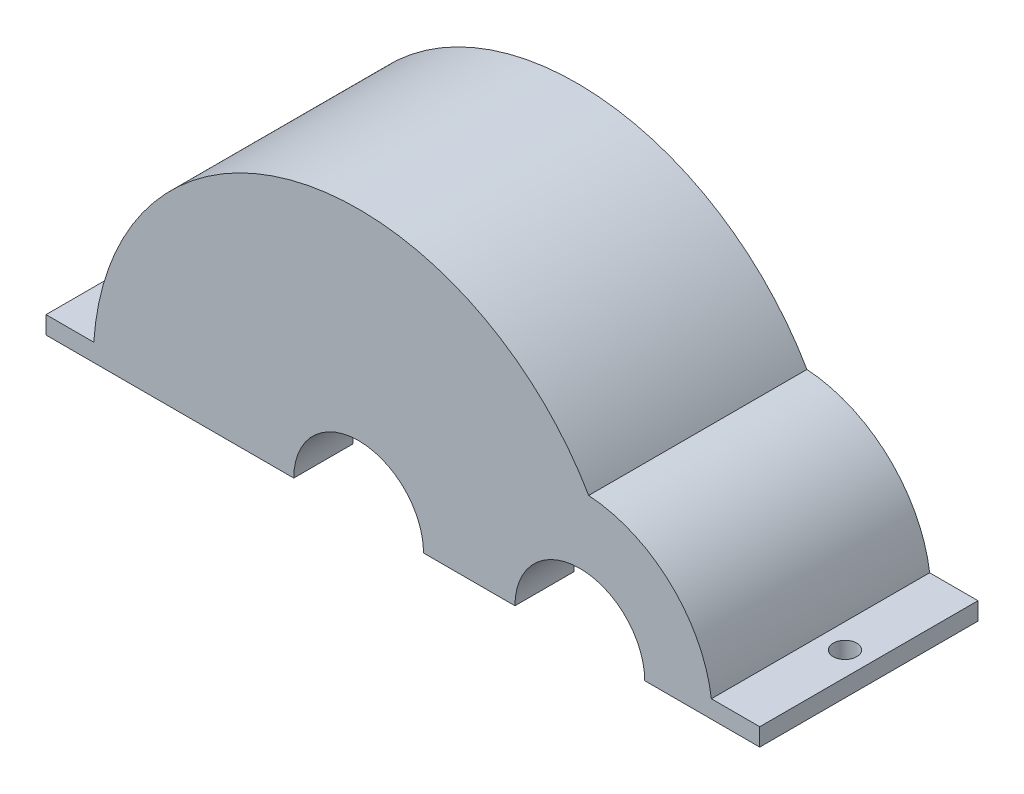
ISO-10303-21;
HEADER;
FILE_DESCRIPTION(('STEP AP214'),'2;1');
FILE_NAME('part.step','',(''),(''),'','','');
FILE_SCHEMA(('AUTOMOTIVE_DESIGN { 1 0 10303 214 1 1 1 1 }'));
ENDSEC;
DATA;
#1=APPLICATION_CONTEXT('core data for automotive mechanical design processes');
#2=APPLICATION_PROTOCOL_DEFINITION('international standard','automotive_design',2000,#1);
#3=PRODUCT_CONTEXT('',#1,'mechanical');
#4=PRODUCT('Part','Part','',(#3));
#5=PRODUCT_RELATED_PRODUCT_CATEGORY('part','',(#4));
#6=PRODUCT_DEFINITION_FORMATION('','',#4);
#7=PRODUCT_DEFINITION_CONTEXT('part definition',#1,'design');
#8=PRODUCT_DEFINITION('design','',#6,#7);
#9=PRODUCT_DEFINITION_SHAPE('','',#8);
#10=(LENGTH_UNIT() NAMED_UNIT(*) SI_UNIT(.MILLI.,.METRE.));
#11=(NAMED_UNIT(*) PLANE_ANGLE_UNIT() SI_UNIT($,.RADIAN.));
#12=(NAMED_UNIT(*) SI_UNIT($,.STERADIAN.) SOLID_ANGLE_UNIT());
#13=UNCERTAINTY_MEASURE_WITH_UNIT(LENGTH_MEASURE(1.E-05),#10,'distance_accuracy_value','');
#14=(GEOMETRIC_REPRESENTATION_CONTEXT(3) GLOBAL_UNCERTAINTY_ASSIGNED_CONTEXT((#13)) GLOBAL_UNIT_ASSIGNED_CONTEXT((#10,
#11,#12)) REPRESENTATION_CONTEXT('',''));
#15=CARTESIAN_POINT('',(0.,0.,0.));
#16=DIRECTION('',(0.,0.,1.));
#17=DIRECTION('',(1.,0.,0.));
#18=AXIS2_PLACEMENT_3D('',#15,#16,#17);
#19=CARTESIAN_POINT('',(-18.75,0.,27.));
#20=DIRECTION('',(0.,0.,-1.));
#21=DIRECTION('',(-1.,0.,0.));
#22=AXIS2_PLACEMENT_3D('',#19,#20,#21);
#23=CYLINDRICAL_SURFACE('',#22,45.);
#24=CARTESIAN_POINT('',(-18.75,0.,-10.));
#25=DIRECTION('',(0.,0.,-1.));
#26=DIRECTION('',(-1.,0.,0.));
#27=AXIS2_PLACEMENT_3D('',#24,#25,#26);
#28=CIRCLE('',#27,45.);
#29=CARTESIAN_POINT('',(-63.6498886412873,3.,-10.));
#30=VERTEX_POINT('',#29);
#31=CARTESIAN_POINT('',(20.25,22.4499443206437,-10.));
#32=VERTEX_POINT('',#31);
#33=EDGE_CURVE('E230',#30,#32,#28,.T.);
#34=ORIENTED_EDGE('',*,*,#33,.F.);
#35=DIRECTION('',(0.,0.,-1.));
#36=VECTOR('',#35,1.);
#37=CARTESIAN_POINT('',(-63.6498886412873,3.,27.));
#38=LINE('',#37,#36);
#39=CARTESIAN_POINT('',(-63.6498886412873,3.,27.));
#40=VERTEX_POINT('',#39);
#41=EDGE_CURVE('E209',#30,#40,#38,.F.);
#42=ORIENTED_EDGE('',*,*,#41,.T.);
#43=CARTESIAN_POINT('',(-18.75,0.,27.));
#44=DIRECTION('',(0.,0.,1.));
#45=DIRECTION('',(1.,0.,0.));
#46=AXIS2_PLACEMENT_3D('',#43,#44,#45);
#47=CIRCLE('',#46,45.);
#48=CARTESIAN_POINT('',(20.25,22.4499443206437,27.));
#49=VERTEX_POINT('',#48);
#50=EDGE_CURVE('E52',#49,#40,#47,.T.);
#51=ORIENTED_EDGE('',*,*,#50,.F.);
#52=DIRECTION('',(0.,0.,-1.));
#53=VECTOR('',#52,1.);
#54=CARTESIAN_POINT('',(20.25,22.4499443206437,27.));
#55=LINE('',#54,#53);
#56=EDGE_CURVE('E11',#49,#32,#55,.T.);
#57=ORIENTED_EDGE('',*,*,#56,.T.);
#58=EDGE_LOOP('',(#34,#42,#51,#57));
#59=FACE_BOUND('',#58,.T.);
#60=ADVANCED_FACE('F43',(#59),#23,.T.);
#61=CARTESIAN_POINT('',(0.,0.,0.));
#62=DIRECTION('',(0.,0.,-1.));
#63=DIRECTION('',(-1.,0.,0.));
#64=AXIS2_PLACEMENT_3D('',#61,#62,#63);
#65=PLANE('',#64);
#66=CARTESIAN_POINT('',(-18.75,0.,0.));
#67=DIRECTION('',(0.,0.,1.));
#68=DIRECTION('',(1.,0.,0.));
#69=AXIS2_PLACEMENT_3D('',#66,#67,#68);
#70=CIRCLE('',#69,35.);
#71=CARTESIAN_POINT('',(14.25,11.6619037896906,0.));
#72=VERTEX_POINT('',#71);
#73=CARTESIAN_POINT('',(-53.75,0.,0.));
#74=VERTEX_POINT('',#73);
#75=EDGE_CURVE('E243',#72,#74,#70,.T.);
#76=ORIENTED_EDGE('',*,*,#75,.T.);
#77=DIRECTION('',(1.,0.,0.));
#78=VECTOR('',#77,1.);
#79=CARTESIAN_POINT('',(0.,0.,0.));
#80=LINE('',#79,#78);
#81=CARTESIAN_POINT('',(-29.75,0.,0.));
#82=VERTEX_POINT('',#81);
#83=EDGE_CURVE('E404',#74,#82,#80,.T.);
#84=ORIENTED_EDGE('',*,*,#83,.T.);
#85=CARTESIAN_POINT('',(-18.75,0.,0.));
#86=DIRECTION('',(0.,0.,-1.));
#87=DIRECTION('',(-1.,0.,0.));
#88=AXIS2_PLACEMENT_3D('',#85,#86,#87);
#89=CIRCLE('',#88,11.);
#90=CARTESIAN_POINT('',(-7.75,0.,0.));
#91=VERTEX_POINT('',#90);
#92=EDGE_CURVE('E223',#82,#91,#89,.T.);
#93=ORIENTED_EDGE('',*,*,#92,.T.);
#94=CARTESIAN_POINT('',(7.75,0.,0.));
#95=VERTEX_POINT('',#94);
#96=EDGE_CURVE('E399',#91,#95,#80,.T.);
#97=ORIENTED_EDGE('',*,*,#96,.T.);
#98=CARTESIAN_POINT('',(18.75,0.,0.));
#99=DIRECTION('',(0.,0.,-1.));
#100=DIRECTION('',(-1.,0.,0.));
#101=AXIS2_PLACEMENT_3D('',#98,#99,#100);
#102=CIRCLE('',#101,11.);
#103=CARTESIAN_POINT('',(29.75,0.,0.));
#104=VERTEX_POINT('',#103);
#105=EDGE_CURVE('E227',#95,#104,#102,.T.);
#106=ORIENTED_EDGE('',*,*,#105,.T.);
#107=CARTESIAN_POINT('',(31.25,0.,0.));
#108=VERTEX_POINT('',#107);
#109=EDGE_CURVE('E405',#104,#108,#80,.T.);
#110=ORIENTED_EDGE('',*,*,#109,.T.);
#111=CARTESIAN_POINT('',(18.75,0.,0.));
#112=DIRECTION('',(0.,0.,1.));
#113=DIRECTION('',(1.,0.,0.));
#114=AXIS2_PLACEMENT_3D('',#111,#112,#113);
#115=CIRCLE('',#114,12.5);
#116=EDGE_CURVE('E235',#108,#72,#115,.T.);
#117=ORIENTED_EDGE('',*,*,#116,.T.);
#118=EDGE_LOOP('',(#76,#84,#93,#97,#106,#110,#117));
#119=FACE_BOUND('',#118,.T.);
#120=ADVANCED_FACE('F320',(#119),#65,.F.);
#121=CARTESIAN_POINT('',(0.,0.,17.));
#122=DIRECTION('',(0.,0.,1.));
#123=DIRECTION('',(1.,0.,0.));
#124=AXIS2_PLACEMENT_3D('',#121,#122,#123);
#125=PLANE('',#124);
#126=CARTESIAN_POINT('',(18.75,0.,17.));
#127=DIRECTION('',(0.,0.,1.));
#128=DIRECTION('',(1.,0.,0.));
#129=AXIS2_PLACEMENT_3D('',#126,#127,#128);
#130=CIRCLE('',#129,12.5);
#131=CARTESIAN_POINT('',(31.25,0.,17.));
#132=VERTEX_POINT('',#131);
#133=CARTESIAN_POINT('',(14.25,11.6619037896906,17.));
#134=VERTEX_POINT('',#133);
#135=EDGE_CURVE('E241',#132,#134,#130,.T.);
#136=ORIENTED_EDGE('',*,*,#135,.F.);
#137=DIRECTION('',(-1.,0.,0.));
#138=VECTOR('',#137,1.);
#139=CARTESIAN_POINT('',(0.,0.,17.));
#140=LINE('',#139,#138);
#141=CARTESIAN_POINT('',(29.75,0.,17.));
#142=VERTEX_POINT('',#141);
#143=EDGE_CURVE('E262',#132,#142,#140,.T.);
#144=ORIENTED_EDGE('',*,*,#143,.T.);
#145=CARTESIAN_POINT('',(18.75,0.,17.));
#146=DIRECTION('',(0.,0.,1.));
#147=DIRECTION('',(1.,0.,0.));
#148=AXIS2_PLACEMENT_3D('',#145,#146,#147);
#149=CIRCLE('',#148,11.);
#150=CARTESIAN_POINT('',(7.75,0.,17.));
#151=VERTEX_POINT('',#150);
#152=EDGE_CURVE('E226',#142,#151,#149,.T.);
#153=ORIENTED_EDGE('',*,*,#152,.T.);
#154=CARTESIAN_POINT('',(-7.75,0.,17.));
#155=VERTEX_POINT('',#154);
#156=EDGE_CURVE('E260',#151,#155,#140,.T.);
#157=ORIENTED_EDGE('',*,*,#156,.T.);
#158=CARTESIAN_POINT('',(-18.75,0.,17.));
#159=DIRECTION('',(0.,0.,1.));
#160=DIRECTION('',(1.,0.,0.));
#161=AXIS2_PLACEMENT_3D('',#158,#159,#160);
#162=CIRCLE('',#161,11.);
#163=CARTESIAN_POINT('',(-29.75,0.,17.));
#164=VERTEX_POINT('',#163);
#165=EDGE_CURVE('E214',#155,#164,#162,.T.);
#166=ORIENTED_EDGE('',*,*,#165,.T.);
#167=CARTESIAN_POINT('',(-53.75,0.,17.));
#168=VERTEX_POINT('',#167);
#169=EDGE_CURVE('E270',#164,#168,#140,.T.);
#170=ORIENTED_EDGE('',*,*,#169,.T.);
#171=CARTESIAN_POINT('',(-18.75,0.,17.));
#172=DIRECTION('',(0.,0.,1.));
#173=DIRECTION('',(1.,0.,0.));
#174=AXIS2_PLACEMENT_3D('',#171,#172,#173);
#175=CIRCLE('',#174,35.);
#176=EDGE_CURVE('E240',#134,#168,#175,.T.);
#177=ORIENTED_EDGE('',*,*,#176,.F.);
#178=EDGE_LOOP('',(#136,#144,#153,#157,#166,#170,#177));
#179=FACE_BOUND('',#178,.T.);
#180=ADVANCED_FACE('F259',(#179),#125,.F.);
#181=CARTESIAN_POINT('',(18.75,0.,27.));
#182=DIRECTION('',(0.,0.,-1.));
#183=DIRECTION('',(-1.,0.,0.));
#184=AXIS2_PLACEMENT_3D('',#181,#182,#183);
#185=CYLINDRICAL_SURFACE('',#184,12.5);
#186=DIRECTION('',(0.,0.,-1.));
#187=VECTOR('',#186,1.);
#188=CARTESIAN_POINT('',(31.25,0.,27.));
#189=LINE('',#188,#187);
#190=EDGE_CURVE('E410',#132,#108,#189,.T.);
#191=ORIENTED_EDGE('',*,*,#190,.F.);
#192=ORIENTED_EDGE('',*,*,#135,.T.);
#193=DIRECTION('',(0.,0.,-1.));
#194=VECTOR('',#193,1.);
#195=CARTESIAN_POINT('',(14.25,11.6619037896906,17.));
#196=LINE('',#195,#194);
#197=EDGE_CURVE('E236',#134,#72,#196,.T.);
#198=ORIENTED_EDGE('',*,*,#197,.T.);
#199=ORIENTED_EDGE('',*,*,#116,.F.);
#200=EDGE_LOOP('',(#191,#192,#198,#199));
#201=FACE_BOUND('',#200,.T.);
#202=ADVANCED_FACE('F329',(#201),#185,.F.);
#203=CARTESIAN_POINT('',(-18.75,0.,27.));
#204=DIRECTION('',(0.,0.,-1.));
#205=DIRECTION('',(-1.,0.,0.));
#206=AXIS2_PLACEMENT_3D('',#203,#204,#205);
#207=CYLINDRICAL_SURFACE('',#206,35.);
#208=DIRECTION('',(0.,0.,-1.));
#209=VECTOR('',#208,1.);
#210=CARTESIAN_POINT('',(-53.75,0.,27.));
#211=LINE('',#210,#209);
#212=EDGE_CURVE('E414',#74,#168,#211,.F.);
#213=ORIENTED_EDGE('',*,*,#212,.F.);
#214=ORIENTED_EDGE('',*,*,#75,.F.);
#215=ORIENTED_EDGE('',*,*,#197,.F.);
#216=ORIENTED_EDGE('',*,*,#176,.T.);
#217=EDGE_LOOP('',(#213,#214,#215,#216));
#218=FACE_BOUND('',#217,.T.);
#219=ADVANCED_FACE('F330',(#218),#207,.F.);
#220=CARTESIAN_POINT('',(-18.75,0.,27.));
#221=DIRECTION('',(0.,0.,-1.));
#222=DIRECTION('',(-1.,0.,0.));
#223=AXIS2_PLACEMENT_3D('',#220,#221,#222);
#224=CYLINDRICAL_SURFACE('',#223,11.);
#225=ORIENTED_EDGE('',*,*,#165,.F.);
#226=DIRECTION('',(0.,0.,-1.));
#227=VECTOR('',#226,1.);
#228=CARTESIAN_POINT('',(-7.75,0.,27.));
#229=LINE('',#228,#227);
#230=CARTESIAN_POINT('',(-7.75000000000001,0.,27.));
#231=VERTEX_POINT('',#230);
#232=EDGE_CURVE('E268',#155,#231,#229,.F.);
#233=ORIENTED_EDGE('',*,*,#232,.T.);
#234=CARTESIAN_POINT('',(-18.75,0.,27.));
#235=DIRECTION('',(0.,0.,-1.));
#236=DIRECTION('',(-1.,0.,0.));
#237=AXIS2_PLACEMENT_3D('',#234,#235,#236);
#238=CIRCLE('',#237,11.);
#239=CARTESIAN_POINT('',(-29.75,0.,27.));
#240=VERTEX_POINT('',#239);
#241=EDGE_CURVE('E218',#240,#231,#238,.T.);
#242=ORIENTED_EDGE('',*,*,#241,.F.);
#243=DIRECTION('',(0.,0.,-1.));
#244=VECTOR('',#243,1.);
#245=CARTESIAN_POINT('',(-29.75,0.,27.));
#246=LINE('',#245,#244);
#247=EDGE_CURVE('E266',#240,#164,#246,.T.);
#248=ORIENTED_EDGE('',*,*,#247,.T.);
#249=EDGE_LOOP('',(#225,#233,#242,#248));
#250=FACE_BOUND('',#249,.T.);
#251=ADVANCED_FACE('F333',(#250),#224,.F.);
#252=CARTESIAN_POINT('',(18.75,0.,27.));
#253=DIRECTION('',(0.,0.,-1.));
#254=DIRECTION('',(-1.,0.,0.));
#255=AXIS2_PLACEMENT_3D('',#252,#253,#254);
#256=CYLINDRICAL_SURFACE('',#255,11.);
#257=ORIENTED_EDGE('',*,*,#152,.F.);
#258=DIRECTION('',(0.,0.,-1.));
#259=VECTOR('',#258,1.);
#260=CARTESIAN_POINT('',(29.75,0.,27.));
#261=LINE('',#260,#259);
#262=CARTESIAN_POINT('',(29.75,0.,27.));
#263=VERTEX_POINT('',#262);
#264=EDGE_CURVE('E265',#142,#263,#261,.F.);
#265=ORIENTED_EDGE('',*,*,#264,.T.);
#266=CARTESIAN_POINT('',(18.75,0.,27.));
#267=DIRECTION('',(0.,0.,-1.));
#268=DIRECTION('',(-1.,0.,0.));
#269=AXIS2_PLACEMENT_3D('',#266,#267,#268);
#270=CIRCLE('',#269,11.);
#271=CARTESIAN_POINT('',(7.75,0.,27.));
#272=VERTEX_POINT('',#271);
#273=EDGE_CURVE('E189',#272,#263,#270,.T.);
#274=ORIENTED_EDGE('',*,*,#273,.F.);
#275=DIRECTION('',(0.,0.,-1.));
#276=VECTOR('',#275,1.);
#277=CARTESIAN_POINT('',(7.75,0.,27.));
#278=LINE('',#277,#276);
#279=EDGE_CURVE('E60',#272,#151,#278,.T.);
#280=ORIENTED_EDGE('',*,*,#279,.T.);
#281=EDGE_LOOP('',(#257,#265,#274,#280));
#282=FACE_BOUND('',#281,.T.);
#283=ADVANCED_FACE('F264',(#282),#256,.F.);
#284=CARTESIAN_POINT('',(-18.75,0.,-10.));
#285=DIRECTION('',(0.,0.,-1.));
#286=DIRECTION('',(-1.,0.,0.));
#287=AXIS2_PLACEMENT_3D('',#284,#285,#286);
#288=CIRCLE('',#287,11.);
#289=CARTESIAN_POINT('',(-29.75,0.,-10.));
#290=VERTEX_POINT('',#289);
#291=CARTESIAN_POINT('',(-7.75,0.,-10.));
#292=VERTEX_POINT('',#291);
#293=EDGE_CURVE('E212',#290,#292,#288,.T.);
#294=ORIENTED_EDGE('',*,*,#293,.T.);
#295=DIRECTION('',(0.,0.,-1.));
#296=VECTOR('',#295,1.);
#297=CARTESIAN_POINT('',(-7.75,0.,27.));
#298=LINE('',#297,#296);
#299=EDGE_CURVE('E68',#292,#91,#298,.F.);
#300=ORIENTED_EDGE('',*,*,#299,.T.);
#301=ORIENTED_EDGE('',*,*,#92,.F.);
#302=DIRECTION('',(0.,0.,-1.));
#303=VECTOR('',#302,1.);
#304=CARTESIAN_POINT('',(-29.75,0.,27.));
#305=LINE('',#304,#303);
#306=EDGE_CURVE('E413',#82,#290,#305,.T.);
#307=ORIENTED_EDGE('',*,*,#306,.T.);
#308=EDGE_LOOP('',(#294,#300,#301,#307));
#309=FACE_BOUND('',#308,.T.);
#310=ADVANCED_FACE('F317',(#309),#224,.F.);
#311=CARTESIAN_POINT('',(18.75,0.,-10.));
#312=DIRECTION('',(0.,0.,-1.));
#313=DIRECTION('',(-1.,0.,0.));
#314=AXIS2_PLACEMENT_3D('',#311,#312,#313);
#315=CIRCLE('',#314,11.);
#316=CARTESIAN_POINT('',(7.75000000000001,0.,-10.));
#317=VERTEX_POINT('',#316);
#318=CARTESIAN_POINT('',(29.75,0.,-10.));
#319=VERTEX_POINT('',#318);
#320=EDGE_CURVE('E215',#317,#319,#315,.T.);
#321=ORIENTED_EDGE('',*,*,#320,.T.);
#322=DIRECTION('',(0.,0.,-1.));
#323=VECTOR('',#322,1.);
#324=CARTESIAN_POINT('',(29.75,0.,27.));
#325=LINE('',#324,#323);
#326=EDGE_CURVE('E407',#319,#104,#325,.F.);
#327=ORIENTED_EDGE('',*,*,#326,.T.);
#328=ORIENTED_EDGE('',*,*,#105,.F.);
#329=DIRECTION('',(0.,0.,-1.));
#330=VECTOR('',#329,1.);
#331=CARTESIAN_POINT('',(7.75,0.,27.));
#332=LINE('',#331,#330);
#333=EDGE_CURVE('E396',#95,#317,#332,.T.);
#334=ORIENTED_EDGE('',*,*,#333,.T.);
#335=EDGE_LOOP('',(#321,#327,#328,#334));
#336=FACE_BOUND('',#335,.T.);
#337=ADVANCED_FACE('F309',(#336),#256,.F.);
#338=CARTESIAN_POINT('',(18.75,0.,27.));
#339=DIRECTION('',(0.,0.,-1.));
#340=DIRECTION('',(-1.,0.,0.));
#341=AXIS2_PLACEMENT_3D('',#338,#339,#340);
#342=CYLINDRICAL_SURFACE('',#341,22.5);
#343=CARTESIAN_POINT('',(18.75,0.,27.));
#344=DIRECTION('',(0.,0.,1.));
#345=DIRECTION('',(1.,0.,0.));
#346=AXIS2_PLACEMENT_3D('',#343,#344,#345);
#347=CIRCLE('',#346,22.5);
#348=CARTESIAN_POINT('',(41.0491031209778,3.,27.));
#349=VERTEX_POINT('',#348);
#350=EDGE_CURVE('E239',#349,#49,#347,.T.);
#351=ORIENTED_EDGE('',*,*,#350,.F.);
#352=DIRECTION('',(0.,0.,-1.));
#353=VECTOR('',#352,1.);
#354=CARTESIAN_POINT('',(41.0491031209778,3.,27.));
#355=LINE('',#354,#353);
#356=CARTESIAN_POINT('',(41.0491031209778,3.,-10.));
#357=VERTEX_POINT('',#356);
#358=EDGE_CURVE('E207',#349,#357,#355,.T.);
#359=ORIENTED_EDGE('',*,*,#358,.T.);
#360=CARTESIAN_POINT('',(18.75,0.,-10.));
#361=DIRECTION('',(0.,0.,-1.));
#362=DIRECTION('',(-1.,0.,0.));
#363=AXIS2_PLACEMENT_3D('',#360,#361,#362);
#364=CIRCLE('',#363,22.5);
#365=EDGE_CURVE('E232',#32,#357,#364,.T.);
#366=ORIENTED_EDGE('',*,*,#365,.F.);
#367=ORIENTED_EDGE('',*,*,#56,.F.);
#368=EDGE_LOOP('',(#351,#359,#366,#367));
#369=FACE_BOUND('',#368,.T.);
#370=ADVANCED_FACE('F45',(#369),#342,.T.);
#371=CARTESIAN_POINT('',(0.,0.,27.));
#372=DIRECTION('',(0.,0.,1.));
#373=DIRECTION('',(1.,0.,0.));
#374=AXIS2_PLACEMENT_3D('',#371,#372,#373);
#375=PLANE('',#374);
#376=DIRECTION('',(1.,0.,0.));
#377=VECTOR('',#376,1.);
#378=CARTESIAN_POINT('',(-71.75,0.,27.));
#379=LINE('',#378,#377);
#380=CARTESIAN_POINT('',(49.25,0.,27.));
#381=VERTEX_POINT('',#380);
#382=EDGE_CURVE('E172',#263,#381,#379,.T.);
#383=ORIENTED_EDGE('',*,*,#382,.T.);
#384=DIRECTION('',(0.,1.,0.));
#385=VECTOR('',#384,1.);
#386=CARTESIAN_POINT('',(49.25,-89.2173431022552,27.));
#387=LINE('',#386,#385);
#388=CARTESIAN_POINT('',(49.25,3.,27.));
#389=VERTEX_POINT('',#388);
#390=EDGE_CURVE('E186',#381,#389,#387,.T.);
#391=ORIENTED_EDGE('',*,*,#390,.T.);
#392=DIRECTION('',(-1.,0.,0.));
#393=VECTOR('',#392,1.);
#394=CARTESIAN_POINT('',(0.,3.,27.));
#395=LINE('',#394,#393);
#396=EDGE_CURVE('E281',#389,#349,#395,.T.);
#397=ORIENTED_EDGE('',*,*,#396,.T.);
#398=ORIENTED_EDGE('',*,*,#350,.T.);
#399=ORIENTED_EDGE('',*,*,#50,.T.);
#400=DIRECTION('',(1.,0.,0.));
#401=VECTOR('',#400,1.);
#402=CARTESIAN_POINT('',(0.,3.,27.));
#403=LINE('',#402,#401);
#404=CARTESIAN_POINT('',(-71.75,3.,27.));
#405=VERTEX_POINT('',#404);
#406=EDGE_CURVE('E197',#405,#40,#403,.T.);
#407=ORIENTED_EDGE('',*,*,#406,.F.);
#408=DIRECTION('',(0.,1.,0.));
#409=VECTOR('',#408,1.);
#410=CARTESIAN_POINT('',(-71.75,-89.2173431022552,27.));
#411=LINE('',#410,#409);
#412=CARTESIAN_POINT('',(-71.75,0.,27.));
#413=VERTEX_POINT('',#412);
#414=EDGE_CURVE('E210',#413,#405,#411,.T.);
#415=ORIENTED_EDGE('',*,*,#414,.F.);
#416=EDGE_CURVE('E180',#413,#240,#379,.T.);
#417=ORIENTED_EDGE('',*,*,#416,.T.);
#418=ORIENTED_EDGE('',*,*,#241,.T.);
#419=EDGE_CURVE('E190',#231,#272,#379,.T.);
#420=ORIENTED_EDGE('',*,*,#419,.T.);
#421=ORIENTED_EDGE('',*,*,#273,.T.);
#422=EDGE_LOOP('',(#383,#391,#397,#398,#399,#407,#415,#417,#418,#420,#421));
#423=FACE_BOUND('',#422,.T.);
#424=ADVANCED_FACE('F184',(#423),#375,.T.);
#425=CARTESIAN_POINT('',(0.,0.,-10.));
#426=DIRECTION('',(0.,0.,-1.));
#427=DIRECTION('',(-1.,0.,0.));
#428=AXIS2_PLACEMENT_3D('',#425,#426,#427);
#429=PLANE('',#428);
#430=DIRECTION('',(-1.,0.,0.));
#431=VECTOR('',#430,1.);
#432=CARTESIAN_POINT('',(-71.75,0.,-10.));
#433=LINE('',#432,#431);
#434=CARTESIAN_POINT('',(-71.75,0.,-10.));
#435=VERTEX_POINT('',#434);
#436=EDGE_CURVE('E179',#290,#435,#433,.T.);
#437=ORIENTED_EDGE('',*,*,#436,.T.);
#438=DIRECTION('',(0.,1.,0.));
#439=VECTOR('',#438,1.);
#440=CARTESIAN_POINT('',(-71.75,-89.2173431022552,-10.));
#441=LINE('',#440,#439);
#442=CARTESIAN_POINT('',(-71.75,3.,-10.));
#443=VERTEX_POINT('',#442);
#444=EDGE_CURVE('E289',#435,#443,#441,.T.);
#445=ORIENTED_EDGE('',*,*,#444,.T.);
#446=DIRECTION('',(-1.,0.,0.));
#447=VECTOR('',#446,1.);
#448=CARTESIAN_POINT('',(0.,3.,-10.));
#449=LINE('',#448,#447);
#450=EDGE_CURVE('E201',#30,#443,#449,.T.);
#451=ORIENTED_EDGE('',*,*,#450,.F.);
#452=ORIENTED_EDGE('',*,*,#33,.T.);
#453=ORIENTED_EDGE('',*,*,#365,.T.);
#454=DIRECTION('',(1.,0.,0.));
#455=VECTOR('',#454,1.);
#456=CARTESIAN_POINT('',(0.,3.,-9.99999999999999));
#457=LINE('',#456,#455);
#458=CARTESIAN_POINT('',(49.25,3.,-9.99999999999999));
#459=VERTEX_POINT('',#458);
#460=EDGE_CURVE('E203',#357,#459,#457,.T.);
#461=ORIENTED_EDGE('',*,*,#460,.T.);
#462=DIRECTION('',(0.,1.,0.));
#463=VECTOR('',#462,1.);
#464=CARTESIAN_POINT('',(49.25,-89.2173431022552,-9.99999999999999));
#465=LINE('',#464,#463);
#466=CARTESIAN_POINT('',(49.25,0.,-9.99999999999999));
#467=VERTEX_POINT('',#466);
#468=EDGE_CURVE('E198',#467,#459,#465,.T.);
#469=ORIENTED_EDGE('',*,*,#468,.F.);
#470=EDGE_CURVE('E175',#467,#319,#433,.T.);
#471=ORIENTED_EDGE('',*,*,#470,.T.);
#472=ORIENTED_EDGE('',*,*,#320,.F.);
#473=EDGE_CURVE('E390',#317,#292,#433,.T.);
#474=ORIENTED_EDGE('',*,*,#473,.T.);
#475=ORIENTED_EDGE('',*,*,#293,.F.);
#476=EDGE_LOOP('',(#437,#445,#451,#452,#453,#461,#469,#471,#472,#474,#475));
#477=FACE_BOUND('',#476,.T.);
#478=ADVANCED_FACE('F297',(#477),#429,.T.);
#479=CARTESIAN_POINT('',(0.,3.,0.));
#480=DIRECTION('',(0.,1.,0.));
#481=DIRECTION('',(0.,0.,1.));
#482=AXIS2_PLACEMENT_3D('',#479,#480,#481);
#483=PLANE('',#482);
#484=CARTESIAN_POINT('',(-67.6999443206437,3.,8.5));
#485=DIRECTION('',(0.,1.,0.));
#486=DIRECTION('',(0.,0.,1.));
#487=AXIS2_PLACEMENT_3D('',#484,#485,#486);
#488=CIRCLE('',#487,2.);
#489=CARTESIAN_POINT('',(-67.6999443206437,3.,10.5));
#490=VERTEX_POINT('',#489);
#491=EDGE_CURVE('E277',#490,#490,#488,.T.);
#492=ORIENTED_EDGE('',*,*,#491,.F.);
#493=EDGE_LOOP('',(#492));
#494=FACE_BOUND('',#493,.T.);
#495=ORIENTED_EDGE('',*,*,#41,.F.);
#496=ORIENTED_EDGE('',*,*,#450,.T.);
#497=DIRECTION('',(0.,0.,1.));
#498=VECTOR('',#497,1.);
#499=CARTESIAN_POINT('',(-71.75,3.,0.));
#500=LINE('',#499,#498);
#501=EDGE_CURVE('E286',#443,#405,#500,.T.);
#502=ORIENTED_EDGE('',*,*,#501,.T.);
#503=ORIENTED_EDGE('',*,*,#406,.T.);
#504=EDGE_LOOP('',(#495,#496,#502,#503));
#505=FACE_BOUND('',#504,.T.);
#506=ADVANCED_FACE('F340',(#494,#505),#483,.T.);
#507=CARTESIAN_POINT('',(-71.75,-89.2173431022552,0.));
#508=DIRECTION('',(-1.,0.,0.));
#509=DIRECTION('',(0.,0.,1.));
#510=AXIS2_PLACEMENT_3D('',#507,#508,#509);
#511=PLANE('',#510);
#512=DIRECTION('',(0.,0.,1.));
#513=VECTOR('',#512,1.);
#514=CARTESIAN_POINT('',(-71.75,0.,-10.));
#515=LINE('',#514,#513);
#516=EDGE_CURVE('E191',#435,#413,#515,.T.);
#517=ORIENTED_EDGE('',*,*,#516,.T.);
#518=ORIENTED_EDGE('',*,*,#414,.T.);
#519=ORIENTED_EDGE('',*,*,#501,.F.);
#520=ORIENTED_EDGE('',*,*,#444,.F.);
#521=EDGE_LOOP('',(#517,#518,#519,#520));
#522=FACE_BOUND('',#521,.T.);
#523=ADVANCED_FACE('F349',(#522),#511,.T.);
#524=CARTESIAN_POINT('',(0.,3.,0.));
#525=DIRECTION('',(0.,1.,0.));
#526=DIRECTION('',(0.,0.,1.));
#527=AXIS2_PLACEMENT_3D('',#524,#525,#526);
#528=PLANE('',#527);
#529=CARTESIAN_POINT('',(45.1999443206437,3.,8.5));
#530=DIRECTION('',(0.,-1.,0.));
#531=DIRECTION('',(0.,0.,-1.));
#532=AXIS2_PLACEMENT_3D('',#529,#530,#531);
#533=CIRCLE('',#532,2.);
#534=CARTESIAN_POINT('',(45.1999443206437,3.,6.5));
#535=VERTEX_POINT('',#534);
#536=EDGE_CURVE('E278',#535,#535,#533,.T.);
#537=ORIENTED_EDGE('',*,*,#536,.T.);
#538=EDGE_LOOP('',(#537));
#539=FACE_BOUND('',#538,.T.);
#540=ORIENTED_EDGE('',*,*,#358,.F.);
#541=ORIENTED_EDGE('',*,*,#396,.F.);
#542=DIRECTION('',(0.,0.,1.));
#543=VECTOR('',#542,1.);
#544=CARTESIAN_POINT('',(49.25,3.,0.));
#545=LINE('',#544,#543);
#546=EDGE_CURVE('E196',#459,#389,#545,.T.);
#547=ORIENTED_EDGE('',*,*,#546,.F.);
#548=ORIENTED_EDGE('',*,*,#460,.F.);
#549=EDGE_LOOP('',(#540,#541,#547,#548));
#550=FACE_BOUND('',#549,.T.);
#551=ADVANCED_FACE('F301',(#539,#550),#528,.T.);
#552=CARTESIAN_POINT('',(49.25,-89.2173431022552,0.));
#553=DIRECTION('',(-1.,0.,0.));
#554=DIRECTION('',(0.,0.,1.));
#555=AXIS2_PLACEMENT_3D('',#552,#553,#554);
#556=PLANE('',#555);
#557=ORIENTED_EDGE('',*,*,#390,.F.);
#558=DIRECTION('',(0.,0.,-1.));
#559=VECTOR('',#558,1.);
#560=CARTESIAN_POINT('',(49.25,0.,-10.));
#561=LINE('',#560,#559);
#562=EDGE_CURVE('E169',#381,#467,#561,.T.);
#563=ORIENTED_EDGE('',*,*,#562,.T.);
#564=ORIENTED_EDGE('',*,*,#468,.T.);
#565=ORIENTED_EDGE('',*,*,#546,.T.);
#566=EDGE_LOOP('',(#557,#563,#564,#565));
#567=FACE_BOUND('',#566,.T.);
#568=ADVANCED_FACE('F194',(#567),#556,.F.);
#569=CARTESIAN_POINT('',(45.1999443206437,-7.,8.5));
#570=DIRECTION('',(0.,1.,0.));
#571=DIRECTION('',(0.,0.,1.));
#572=AXIS2_PLACEMENT_3D('',#569,#570,#571);
#573=CYLINDRICAL_SURFACE('',#572,2.);
#574=CARTESIAN_POINT('',(45.1999443206437,0.,8.5));
#575=DIRECTION('',(0.,1.,0.));
#576=DIRECTION('',(0.,0.,1.));
#577=AXIS2_PLACEMENT_3D('',#574,#575,#576);
#578=CIRCLE('',#577,2.);
#579=CARTESIAN_POINT('',(45.1999443206437,0.,10.5));
#580=VERTEX_POINT('',#579);
#581=EDGE_CURVE('E394',#580,#580,#578,.T.);
#582=ORIENTED_EDGE('',*,*,#581,.F.);
#583=EDGE_LOOP('',(#582));
#584=FACE_BOUND('',#583,.T.);
#585=ORIENTED_EDGE('',*,*,#536,.F.);
#586=EDGE_LOOP('',(#585));
#587=FACE_BOUND('',#586,.T.);
#588=ADVANCED_FACE('F346',(#584,#587),#573,.F.);
#589=CARTESIAN_POINT('',(-67.6999443206437,-7.,8.5));
#590=DIRECTION('',(0.,1.,0.));
#591=DIRECTION('',(0.,0.,1.));
#592=AXIS2_PLACEMENT_3D('',#589,#590,#591);
#593=CYLINDRICAL_SURFACE('',#592,2.);
#594=CARTESIAN_POINT('',(-67.6999443206437,0.,8.5));
#595=DIRECTION('',(0.,1.,0.));
#596=DIRECTION('',(0.,0.,1.));
#597=AXIS2_PLACEMENT_3D('',#594,#595,#596);
#598=CIRCLE('',#597,2.);
#599=CARTESIAN_POINT('',(-67.6999443206437,0.,10.5));
#600=VERTEX_POINT('',#599);
#601=EDGE_CURVE('E47',#600,#600,#598,.F.);
#602=ORIENTED_EDGE('',*,*,#601,.T.);
#603=EDGE_LOOP('',(#602));
#604=FACE_BOUND('',#603,.T.);
#605=ORIENTED_EDGE('',*,*,#491,.T.);
#606=EDGE_LOOP('',(#605));
#607=FACE_BOUND('',#606,.T.);
#608=ADVANCED_FACE('F356',(#604,#607),#593,.F.);
#609=CARTESIAN_POINT('',(0.,0.,0.));
#610=DIRECTION('',(0.,1.,0.));
#611=DIRECTION('',(0.,0.,1.));
#612=AXIS2_PLACEMENT_3D('',#609,#610,#611);
#613=PLANE('',#612);
#614=ORIENTED_EDGE('',*,*,#601,.F.);
#615=EDGE_LOOP('',(#614));
#616=FACE_BOUND('',#615,.T.);
#617=ORIENTED_EDGE('',*,*,#416,.F.);
#618=ORIENTED_EDGE('',*,*,#516,.F.);
#619=ORIENTED_EDGE('',*,*,#436,.F.);
#620=ORIENTED_EDGE('',*,*,#306,.F.);
#621=ORIENTED_EDGE('',*,*,#83,.F.);
#622=ORIENTED_EDGE('',*,*,#212,.T.);
#623=ORIENTED_EDGE('',*,*,#169,.F.);
#624=ORIENTED_EDGE('',*,*,#247,.F.);
#625=EDGE_LOOP('',(#617,#618,#619,#620,#621,#622,#623,#624));
#626=FACE_BOUND('',#625,.T.);
#627=ADVANCED_FACE('F359',(#616,#626),#613,.F.);
#628=ORIENTED_EDGE('',*,*,#581,.T.);
#629=EDGE_LOOP('',(#628));
#630=FACE_BOUND('',#629,.T.);
#631=ORIENTED_EDGE('',*,*,#143,.F.);
#632=ORIENTED_EDGE('',*,*,#190,.T.);
#633=ORIENTED_EDGE('',*,*,#109,.F.);
#634=ORIENTED_EDGE('',*,*,#326,.F.);
#635=ORIENTED_EDGE('',*,*,#470,.F.);
#636=ORIENTED_EDGE('',*,*,#562,.F.);
#637=ORIENTED_EDGE('',*,*,#382,.F.);
#638=ORIENTED_EDGE('',*,*,#264,.F.);
#639=EDGE_LOOP('',(#631,#632,#633,#634,#635,#636,#637,#638));
#640=FACE_BOUND('',#639,.T.);
#641=ADVANCED_FACE('F171',(#630,#640),#613,.F.);
#642=ORIENTED_EDGE('',*,*,#473,.F.);
#643=ORIENTED_EDGE('',*,*,#333,.F.);
#644=ORIENTED_EDGE('',*,*,#96,.F.);
#645=ORIENTED_EDGE('',*,*,#299,.F.);
#646=EDGE_LOOP('',(#642,#643,#644,#645));
#647=FACE_BOUND('',#646,.T.);
#648=ADVANCED_FACE('F366',(#647),#613,.F.);
#649=ORIENTED_EDGE('',*,*,#156,.F.);
#650=ORIENTED_EDGE('',*,*,#279,.F.);
#651=ORIENTED_EDGE('',*,*,#419,.F.);
#652=ORIENTED_EDGE('',*,*,#232,.F.);
#653=EDGE_LOOP('',(#649,#650,#651,#652));
#654=FACE_BOUND('',#653,.T.);
#655=ADVANCED_FACE('F364',(#654),#613,.F.);
#656=CLOSED_SHELL('',(#60,#120,#180,#202,#219,#251,#283,#310,#337,#370,#424,#478,#506,#523,#551,
#568,#588,#608,#627,#641,#648,#655));
#657=MANIFOLD_SOLID_BREP('B2',#656);
#658=ADVANCED_BREP_SHAPE_REPRESENTATION('',(#18,#657),#14);
#659=SHAPE_DEFINITION_REPRESENTATION(#9,#658);
ENDSEC;
END-ISO-10303-21;
